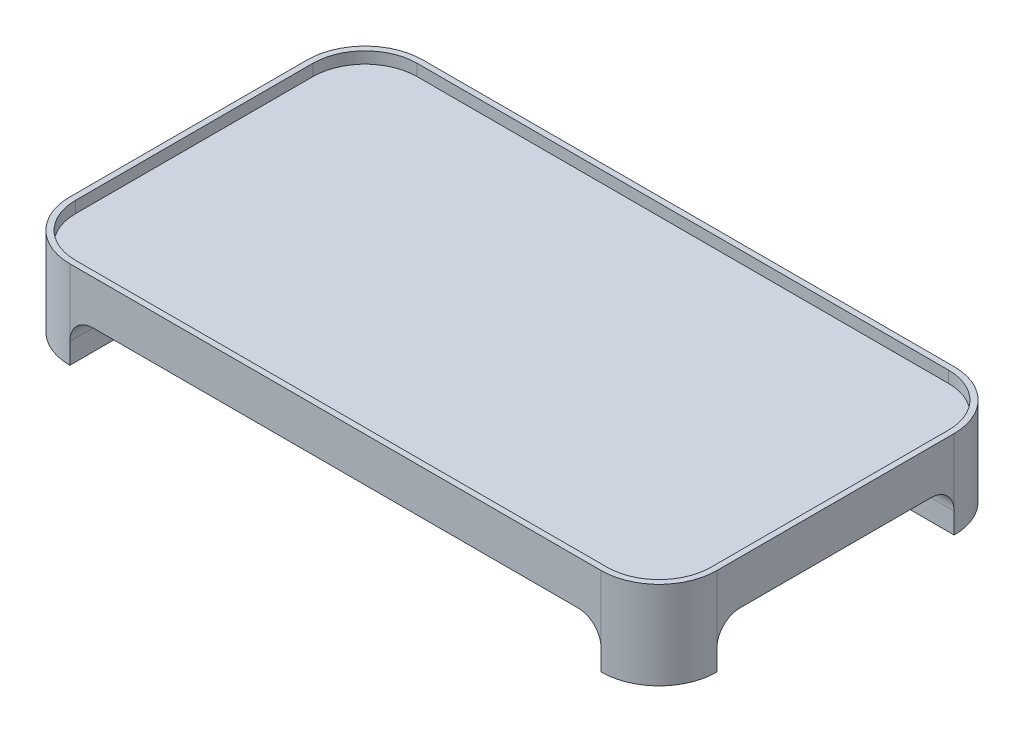
ISO-10303-21;
HEADER;
FILE_DESCRIPTION(('STEP AP214'),'2;1');
FILE_NAME('part.step','',(''),(''),'','','');
FILE_SCHEMA(('AUTOMOTIVE_DESIGN { 1 0 10303 214 1 1 1 1 }'));
ENDSEC;
DATA;
#1=APPLICATION_CONTEXT('core data for automotive mechanical design processes');
#2=APPLICATION_PROTOCOL_DEFINITION('international standard','automotive_design',2000,#1);
#3=PRODUCT_CONTEXT('',#1,'mechanical');
#4=PRODUCT('Part','Part','',(#3));
#5=PRODUCT_RELATED_PRODUCT_CATEGORY('part','',(#4));
#6=PRODUCT_DEFINITION_FORMATION('','',#4);
#7=PRODUCT_DEFINITION_CONTEXT('part definition',#1,'design');
#8=PRODUCT_DEFINITION('design','',#6,#7);
#9=PRODUCT_DEFINITION_SHAPE('','',#8);
#10=(LENGTH_UNIT() NAMED_UNIT(*) SI_UNIT(.MILLI.,.METRE.));
#11=(NAMED_UNIT(*) PLANE_ANGLE_UNIT() SI_UNIT($,.RADIAN.));
#12=(NAMED_UNIT(*) SI_UNIT($,.STERADIAN.) SOLID_ANGLE_UNIT());
#13=UNCERTAINTY_MEASURE_WITH_UNIT(LENGTH_MEASURE(1.E-05),#10,'distance_accuracy_value','');
#14=(GEOMETRIC_REPRESENTATION_CONTEXT(3) GLOBAL_UNCERTAINTY_ASSIGNED_CONTEXT((#13)) GLOBAL_UNIT_ASSIGNED_CONTEXT((#10,
#11,#12)) REPRESENTATION_CONTEXT('',''));
#15=CARTESIAN_POINT('',(0.,0.,0.));
#16=DIRECTION('',(0.,0.,1.));
#17=DIRECTION('',(1.,0.,0.));
#18=AXIS2_PLACEMENT_3D('',#15,#16,#17);
#19=CARTESIAN_POINT('',(-229.5,0.,-102.5));
#20=DIRECTION('',(0.,1.,0.));
#21=DIRECTION('',(0.,0.,1.));
#22=AXIS2_PLACEMENT_3D('',#19,#20,#21);
#23=PLANE('',#22);
#24=DIRECTION('',(0.,0.,1.));
#25=VECTOR('',#24,1.);
#26=CARTESIAN_POINT('',(-229.5,0.,-152.5));
#27=LINE('',#26,#25);
#28=CARTESIAN_POINT('',(-229.5,0.,-152.5));
#29=VERTEX_POINT('',#28);
#30=CARTESIAN_POINT('',(-229.5,0.,-102.5));
#31=VERTEX_POINT('',#30);
#32=EDGE_CURVE('E347',#29,#31,#27,.T.);
#33=ORIENTED_EDGE('',*,*,#32,.T.);
#34=DIRECTION('',(-1.,0.,0.));
#35=VECTOR('',#34,1.);
#36=CARTESIAN_POINT('',(279.5,0.,-102.5));
#37=LINE('',#36,#35);
#38=CARTESIAN_POINT('',(-279.5,0.,-102.5));
#39=VERTEX_POINT('',#38);
#40=EDGE_CURVE('E454',#31,#39,#37,.T.);
#41=ORIENTED_EDGE('',*,*,#40,.T.);
#42=CARTESIAN_POINT('',(-229.5,0.,-102.5));
#43=DIRECTION('',(0.,1.,0.));
#44=DIRECTION('',(0.,0.,1.));
#45=AXIS2_PLACEMENT_3D('',#42,#43,#44);
#46=CIRCLE('',#45,50.);
#47=EDGE_CURVE('E261',#29,#39,#46,.T.);
#48=ORIENTED_EDGE('',*,*,#47,.F.);
#49=EDGE_LOOP('',(#33,#41,#48));
#50=FACE_BOUND('',#49,.T.);
#51=ADVANCED_FACE('F33',(#50),#23,.F.);
#52=CARTESIAN_POINT('',(229.5,0.,-102.5));
#53=DIRECTION('',(0.,1.,0.));
#54=DIRECTION('',(0.,0.,1.));
#55=AXIS2_PLACEMENT_3D('',#52,#53,#54);
#56=CIRCLE('',#55,50.);
#57=CARTESIAN_POINT('',(279.5,0.,-102.5));
#58=VERTEX_POINT('',#57);
#59=CARTESIAN_POINT('',(229.5,0.,-152.5));
#60=VERTEX_POINT('',#59);
#61=EDGE_CURVE('E254',#58,#60,#56,.T.);
#62=ORIENTED_EDGE('',*,*,#61,.F.);
#63=CARTESIAN_POINT('',(229.5,0.,-102.5));
#64=VERTEX_POINT('',#63);
#65=EDGE_CURVE('E309',#58,#64,#37,.T.);
#66=ORIENTED_EDGE('',*,*,#65,.T.);
#67=DIRECTION('',(0.,0.,1.));
#68=VECTOR('',#67,1.);
#69=CARTESIAN_POINT('',(229.5,0.,-152.5));
#70=LINE('',#69,#68);
#71=EDGE_CURVE('E366',#60,#64,#70,.T.);
#72=ORIENTED_EDGE('',*,*,#71,.F.);
#73=EDGE_LOOP('',(#62,#66,#72));
#74=FACE_BOUND('',#73,.T.);
#75=ADVANCED_FACE('F537',(#74),#23,.F.);
#76=CARTESIAN_POINT('',(-229.5,0.,-152.5));
#77=DIRECTION('',(-1.,0.,0.));
#78=DIRECTION('',(0.,0.,1.));
#79=AXIS2_PLACEMENT_3D('',#76,#77,#78);
#80=PLANE('',#79);
#81=DIRECTION('',(0.,0.,1.));
#82=VECTOR('',#81,1.);
#83=CARTESIAN_POINT('',(-229.5,17.9999999999999,-152.5));
#84=LINE('',#83,#82);
#85=CARTESIAN_POINT('',(-229.5,17.9999999999999,-152.5));
#86=VERTEX_POINT('',#85);
#87=CARTESIAN_POINT('',(-229.5,17.9999999999999,-102.5));
#88=VERTEX_POINT('',#87);
#89=EDGE_CURVE('E352',#86,#88,#84,.T.);
#90=ORIENTED_EDGE('',*,*,#89,.T.);
#91=DIRECTION('',(0.,-1.,0.));
#92=VECTOR('',#91,1.);
#93=CARTESIAN_POINT('',(-229.5,0.,-102.5));
#94=LINE('',#93,#92);
#95=EDGE_CURVE('E317',#88,#31,#94,.T.);
#96=ORIENTED_EDGE('',*,*,#95,.T.);
#97=ORIENTED_EDGE('',*,*,#32,.F.);
#98=DIRECTION('',(0.,-1.,0.));
#99=VECTOR('',#98,1.);
#100=CARTESIAN_POINT('',(-229.5,0.,-152.5));
#101=LINE('',#100,#99);
#102=EDGE_CURVE('E333',#86,#29,#101,.T.);
#103=ORIENTED_EDGE('',*,*,#102,.F.);
#104=EDGE_LOOP('',(#90,#96,#97,#103));
#105=FACE_BOUND('',#104,.T.);
#106=ADVANCED_FACE('F550',(#105),#80,.F.);
#107=CARTESIAN_POINT('',(-209.5,18.,-152.5));
#108=DIRECTION('',(0.,0.,1.));
#109=DIRECTION('',(1.,0.,0.));
#110=AXIS2_PLACEMENT_3D('',#107,#108,#109);
#111=CYLINDRICAL_SURFACE('',#110,20.);
#112=DIRECTION('',(0.,0.,1.));
#113=VECTOR('',#112,1.);
#114=CARTESIAN_POINT('',(-209.499999999999,38.,-152.5));
#115=LINE('',#114,#113);
#116=CARTESIAN_POINT('',(-209.499999999999,38.,-152.5));
#117=VERTEX_POINT('',#116);
#118=CARTESIAN_POINT('',(-209.499999999999,38.,-82.4999999999995));
#119=VERTEX_POINT('',#118);
#120=EDGE_CURVE('E356',#117,#119,#115,.T.);
#121=ORIENTED_EDGE('',*,*,#120,.T.);
#122=CARTESIAN_POINT('',(-209.5,18.,-82.4999999999996));
#123=DIRECTION('',(-0.707106781186547,0.,0.707106781186547));
#124=DIRECTION('',(0.707106781186547,0.,0.707106781186547));
#125=AXIS2_PLACEMENT_3D('',#122,#123,#124);
#126=ELLIPSE('',#125,28.2842712474619,20.);
#127=EDGE_CURVE('E314',#119,#88,#126,.T.);
#128=ORIENTED_EDGE('',*,*,#127,.T.);
#129=ORIENTED_EDGE('',*,*,#89,.F.);
#130=CARTESIAN_POINT('',(-209.5,18.,-152.5));
#131=DIRECTION('',(0.,0.,1.));
#132=DIRECTION('',(-1.,0.,0.));
#133=AXIS2_PLACEMENT_3D('',#130,#131,#132);
#134=CIRCLE('',#133,20.);
#135=EDGE_CURVE('E330',#117,#86,#134,.T.);
#136=ORIENTED_EDGE('',*,*,#135,.F.);
#137=EDGE_LOOP('',(#121,#128,#129,#136));
#138=FACE_BOUND('',#137,.T.);
#139=ADVANCED_FACE('F566',(#138),#111,.F.);
#140=CARTESIAN_POINT('',(209.5,18.,-152.5));
#141=DIRECTION('',(0.,0.,1.));
#142=DIRECTION('',(1.,0.,0.));
#143=AXIS2_PLACEMENT_3D('',#140,#141,#142);
#144=CYLINDRICAL_SURFACE('',#143,20.);
#145=DIRECTION('',(0.,0.,1.));
#146=VECTOR('',#145,1.);
#147=CARTESIAN_POINT('',(229.5,17.9999999999999,-152.5));
#148=LINE('',#147,#146);
#149=CARTESIAN_POINT('',(229.5,17.9999999999999,-152.5));
#150=VERTEX_POINT('',#149);
#151=CARTESIAN_POINT('',(229.5,17.9999999999999,-102.5));
#152=VERTEX_POINT('',#151);
#153=EDGE_CURVE('E363',#150,#152,#148,.T.);
#154=ORIENTED_EDGE('',*,*,#153,.T.);
#155=CARTESIAN_POINT('',(209.5,18.,-82.4999999999996));
#156=DIRECTION('',(0.707106781186547,0.,0.707106781186547));
#157=DIRECTION('',(-0.707106781186547,0.,0.707106781186547));
#158=AXIS2_PLACEMENT_3D('',#155,#156,#157);
#159=ELLIPSE('',#158,28.2842712474619,20.);
#160=CARTESIAN_POINT('',(209.5,38.,-82.4999999999995));
#161=VERTEX_POINT('',#160);
#162=EDGE_CURVE('E306',#152,#161,#159,.T.);
#163=ORIENTED_EDGE('',*,*,#162,.T.);
#164=DIRECTION('',(0.,0.,1.));
#165=VECTOR('',#164,1.);
#166=CARTESIAN_POINT('',(209.5,38.,-152.5));
#167=LINE('',#166,#165);
#168=CARTESIAN_POINT('',(209.5,38.,-152.5));
#169=VERTEX_POINT('',#168);
#170=EDGE_CURVE('E360',#169,#161,#167,.T.);
#171=ORIENTED_EDGE('',*,*,#170,.F.);
#172=CARTESIAN_POINT('',(209.5,18.,-152.5));
#173=DIRECTION('',(0.,0.,1.));
#174=DIRECTION('',(1.,0.,0.));
#175=AXIS2_PLACEMENT_3D('',#172,#173,#174);
#176=CIRCLE('',#175,20.);
#177=EDGE_CURVE('E323',#150,#169,#176,.T.);
#178=ORIENTED_EDGE('',*,*,#177,.F.);
#179=EDGE_LOOP('',(#154,#163,#171,#178));
#180=FACE_BOUND('',#179,.T.);
#181=ADVANCED_FACE('F542',(#180),#144,.F.);
#182=CARTESIAN_POINT('',(229.5,17.9999999999999,-152.5));
#183=DIRECTION('',(1.,0.,0.));
#184=DIRECTION('',(0.,0.,-1.));
#185=AXIS2_PLACEMENT_3D('',#182,#183,#184);
#186=PLANE('',#185);
#187=ORIENTED_EDGE('',*,*,#71,.T.);
#188=DIRECTION('',(0.,1.,0.));
#189=VECTOR('',#188,1.);
#190=CARTESIAN_POINT('',(229.5,17.9999999999999,-102.5));
#191=LINE('',#190,#189);
#192=EDGE_CURVE('E11',#64,#152,#191,.T.);
#193=ORIENTED_EDGE('',*,*,#192,.T.);
#194=ORIENTED_EDGE('',*,*,#153,.F.);
#195=DIRECTION('',(0.,1.,0.));
#196=VECTOR('',#195,1.);
#197=CARTESIAN_POINT('',(229.5,17.9999999999999,-152.5));
#198=LINE('',#197,#196);
#199=EDGE_CURVE('E320',#60,#150,#198,.T.);
#200=ORIENTED_EDGE('',*,*,#199,.F.);
#201=EDGE_LOOP('',(#187,#193,#194,#200));
#202=FACE_BOUND('',#201,.T.);
#203=ADVANCED_FACE('F535',(#202),#186,.F.);
#204=CARTESIAN_POINT('',(-229.5,0.,102.5));
#205=DIRECTION('',(0.,1.,0.));
#206=DIRECTION('',(0.,0.,-1.));
#207=AXIS2_PLACEMENT_3D('',#204,#205,#206);
#208=CIRCLE('',#207,50.);
#209=CARTESIAN_POINT('',(-279.5,0.,102.5));
#210=VERTEX_POINT('',#209);
#211=CARTESIAN_POINT('',(-229.5,0.,152.5));
#212=VERTEX_POINT('',#211);
#213=EDGE_CURVE('E255',#210,#212,#208,.T.);
#214=ORIENTED_EDGE('',*,*,#213,.F.);
#215=DIRECTION('',(-1.,0.,0.));
#216=VECTOR('',#215,1.);
#217=CARTESIAN_POINT('',(279.5,0.,102.5));
#218=LINE('',#217,#216);
#219=CARTESIAN_POINT('',(-229.5,0.,102.5));
#220=VERTEX_POINT('',#219);
#221=EDGE_CURVE('E247',#220,#210,#218,.T.);
#222=ORIENTED_EDGE('',*,*,#221,.F.);
#223=EDGE_CURVE('E351',#220,#212,#27,.T.);
#224=ORIENTED_EDGE('',*,*,#223,.T.);
#225=EDGE_LOOP('',(#214,#222,#224));
#226=FACE_BOUND('',#225,.T.);
#227=ADVANCED_FACE('F533',(#226),#23,.F.);
#228=CARTESIAN_POINT('',(-229.5,76.,-102.5));
#229=DIRECTION('',(0.,-1.,0.));
#230=DIRECTION('',(0.,0.,-1.));
#231=AXIS2_PLACEMENT_3D('',#228,#229,#230);
#232=CYLINDRICAL_SURFACE('',#231,50.);
#233=ORIENTED_EDGE('',*,*,#47,.T.);
#234=DIRECTION('',(0.,-1.,0.));
#235=VECTOR('',#234,1.);
#236=CARTESIAN_POINT('',(-279.5,0.,-102.5));
#237=LINE('',#236,#235);
#238=CARTESIAN_POINT('',(-279.5,17.9999999999999,-102.5));
#239=VERTEX_POINT('',#238);
#240=EDGE_CURVE('E238',#239,#39,#237,.T.);
#241=ORIENTED_EDGE('',*,*,#240,.F.);
#242=DIRECTION('',(0.,-1.,0.));
#243=VECTOR('',#242,1.);
#244=CARTESIAN_POINT('',(-279.5,76.,-102.5));
#245=LINE('',#244,#243);
#246=CARTESIAN_POINT('',(-279.5,76.,-102.5));
#247=VERTEX_POINT('',#246);
#248=EDGE_CURVE('E285',#247,#239,#245,.T.);
#249=ORIENTED_EDGE('',*,*,#248,.F.);
#250=CARTESIAN_POINT('',(-229.5,76.,-102.5));
#251=DIRECTION('',(0.,1.,0.));
#252=DIRECTION('',(0.,0.,1.));
#253=AXIS2_PLACEMENT_3D('',#250,#251,#252);
#254=CIRCLE('',#253,50.);
#255=CARTESIAN_POINT('',(-229.5,76.,-152.5));
#256=VERTEX_POINT('',#255);
#257=EDGE_CURVE('E258',#256,#247,#254,.T.);
#258=ORIENTED_EDGE('',*,*,#257,.F.);
#259=DIRECTION('',(0.,-1.,0.));
#260=VECTOR('',#259,1.);
#261=CARTESIAN_POINT('',(-229.5,76.,-152.5));
#262=LINE('',#261,#260);
#263=EDGE_CURVE('E265',#256,#86,#262,.T.);
#264=ORIENTED_EDGE('',*,*,#263,.T.);
#265=ORIENTED_EDGE('',*,*,#102,.T.);
#266=EDGE_LOOP('',(#233,#241,#249,#258,#264,#265));
#267=FACE_BOUND('',#266,.T.);
#268=ADVANCED_FACE('F35',(#267),#232,.T.);
#269=CARTESIAN_POINT('',(-279.5,76.,-102.5));
#270=DIRECTION('',(1.,0.,0.));
#271=DIRECTION('',(0.,0.,-1.));
#272=AXIS2_PLACEMENT_3D('',#269,#270,#271);
#273=PLANE('',#272);
#274=ORIENTED_EDGE('',*,*,#248,.T.);
#275=CARTESIAN_POINT('',(-279.5,18.,-82.4999999999996));
#276=DIRECTION('',(-1.,0.,0.));
#277=DIRECTION('',(0.,0.,-1.));
#278=AXIS2_PLACEMENT_3D('',#275,#276,#277);
#279=CIRCLE('',#278,20.);
#280=CARTESIAN_POINT('',(-279.5,38.,-82.4999999999995));
#281=VERTEX_POINT('',#280);
#282=EDGE_CURVE('E489',#281,#239,#279,.T.);
#283=ORIENTED_EDGE('',*,*,#282,.F.);
#284=DIRECTION('',(0.,0.,-1.));
#285=VECTOR('',#284,1.);
#286=CARTESIAN_POINT('',(-279.5,38.,-82.4999999999995));
#287=LINE('',#286,#285);
#288=CARTESIAN_POINT('',(-279.5,38.,82.4999999999995));
#289=VERTEX_POINT('',#288);
#290=EDGE_CURVE('E476',#289,#281,#287,.T.);
#291=ORIENTED_EDGE('',*,*,#290,.F.);
#292=CARTESIAN_POINT('',(-279.5,18.,82.4999999999997));
#293=DIRECTION('',(-1.,0.,0.));
#294=DIRECTION('',(0.,0.,1.));
#295=AXIS2_PLACEMENT_3D('',#292,#293,#294);
#296=CIRCLE('',#295,20.);
#297=CARTESIAN_POINT('',(-279.5,17.9999999999999,102.5));
#298=VERTEX_POINT('',#297);
#299=EDGE_CURVE('E479',#298,#289,#296,.T.);
#300=ORIENTED_EDGE('',*,*,#299,.F.);
#301=DIRECTION('',(0.,-1.,0.));
#302=VECTOR('',#301,1.);
#303=CARTESIAN_POINT('',(-279.5,76.,102.5));
#304=LINE('',#303,#302);
#305=CARTESIAN_POINT('',(-279.5,76.,102.5));
#306=VERTEX_POINT('',#305);
#307=EDGE_CURVE('E282',#306,#298,#304,.T.);
#308=ORIENTED_EDGE('',*,*,#307,.F.);
#309=DIRECTION('',(0.,0.,1.));
#310=VECTOR('',#309,1.);
#311=CARTESIAN_POINT('',(-279.5,76.,-102.5));
#312=LINE('',#311,#310);
#313=EDGE_CURVE('E434',#247,#306,#312,.T.);
#314=ORIENTED_EDGE('',*,*,#313,.F.);
#315=EDGE_LOOP('',(#274,#283,#291,#300,#308,#314));
#316=FACE_BOUND('',#315,.T.);
#317=ADVANCED_FACE('F487',(#316),#273,.F.);
#318=CARTESIAN_POINT('',(-229.5,76.,102.5));
#319=DIRECTION('',(0.,-1.,0.));
#320=DIRECTION('',(0.,0.,-1.));
#321=AXIS2_PLACEMENT_3D('',#318,#319,#320);
#322=CYLINDRICAL_SURFACE('',#321,50.);
#323=ORIENTED_EDGE('',*,*,#213,.T.);
#324=DIRECTION('',(0.,-1.,0.));
#325=VECTOR('',#324,1.);
#326=CARTESIAN_POINT('',(-229.5,0.,152.5));
#327=LINE('',#326,#325);
#328=CARTESIAN_POINT('',(-229.5,17.9999999999999,152.5));
#329=VERTEX_POINT('',#328);
#330=EDGE_CURVE('E324',#329,#212,#327,.T.);
#331=ORIENTED_EDGE('',*,*,#330,.F.);
#332=DIRECTION('',(0.,-1.,0.));
#333=VECTOR('',#332,1.);
#334=CARTESIAN_POINT('',(-229.5,76.,152.5));
#335=LINE('',#334,#333);
#336=CARTESIAN_POINT('',(-229.5,76.,152.5));
#337=VERTEX_POINT('',#336);
#338=EDGE_CURVE('E279',#337,#329,#335,.T.);
#339=ORIENTED_EDGE('',*,*,#338,.F.);
#340=CARTESIAN_POINT('',(-229.5,76.,102.5));
#341=DIRECTION('',(0.,1.,0.));
#342=DIRECTION('',(0.,0.,-1.));
#343=AXIS2_PLACEMENT_3D('',#340,#341,#342);
#344=CIRCLE('',#343,50.);
#345=EDGE_CURVE('E436',#306,#337,#344,.T.);
#346=ORIENTED_EDGE('',*,*,#345,.F.);
#347=ORIENTED_EDGE('',*,*,#307,.T.);
#348=DIRECTION('',(0.,1.,0.));
#349=VECTOR('',#348,1.);
#350=CARTESIAN_POINT('',(-279.5,17.9999999999999,102.5));
#351=LINE('',#350,#349);
#352=EDGE_CURVE('E485',#210,#298,#351,.T.);
#353=ORIENTED_EDGE('',*,*,#352,.F.);
#354=EDGE_LOOP('',(#323,#331,#339,#346,#347,#353));
#355=FACE_BOUND('',#354,.T.);
#356=ADVANCED_FACE('F523',(#355),#322,.T.);
#357=CARTESIAN_POINT('',(-229.5,76.,152.5));
#358=DIRECTION('',(0.,0.,-1.));
#359=DIRECTION('',(-1.,0.,0.));
#360=AXIS2_PLACEMENT_3D('',#357,#358,#359);
#361=PLANE('',#360);
#362=ORIENTED_EDGE('',*,*,#338,.T.);
#363=CARTESIAN_POINT('',(-209.5,18.,152.5));
#364=DIRECTION('',(0.,0.,1.));
#365=DIRECTION('',(-1.,0.,0.));
#366=AXIS2_PLACEMENT_3D('',#363,#364,#365);
#367=CIRCLE('',#366,20.);
#368=CARTESIAN_POINT('',(-209.499999999999,38.,152.5));
#369=VERTEX_POINT('',#368);
#370=EDGE_CURVE('E342',#369,#329,#367,.T.);
#371=ORIENTED_EDGE('',*,*,#370,.F.);
#372=DIRECTION('',(-1.,0.,0.));
#373=VECTOR('',#372,1.);
#374=CARTESIAN_POINT('',(-209.499999999999,38.,152.5));
#375=LINE('',#374,#373);
#376=CARTESIAN_POINT('',(209.5,38.,152.5));
#377=VERTEX_POINT('',#376);
#378=EDGE_CURVE('E339',#377,#369,#375,.T.);
#379=ORIENTED_EDGE('',*,*,#378,.F.);
#380=CARTESIAN_POINT('',(209.5,18.,152.5));
#381=DIRECTION('',(0.,0.,1.));
#382=DIRECTION('',(1.,0.,0.));
#383=AXIS2_PLACEMENT_3D('',#380,#381,#382);
#384=CIRCLE('',#383,20.);
#385=CARTESIAN_POINT('',(229.5,17.9999999999999,152.5));
#386=VERTEX_POINT('',#385);
#387=EDGE_CURVE('E337',#386,#377,#384,.T.);
#388=ORIENTED_EDGE('',*,*,#387,.F.);
#389=DIRECTION('',(0.,-1.,0.));
#390=VECTOR('',#389,1.);
#391=CARTESIAN_POINT('',(229.5,76.,152.5));
#392=LINE('',#391,#390);
#393=CARTESIAN_POINT('',(229.5,76.,152.5));
#394=VERTEX_POINT('',#393);
#395=EDGE_CURVE('E277',#394,#386,#392,.T.);
#396=ORIENTED_EDGE('',*,*,#395,.F.);
#397=DIRECTION('',(1.,0.,0.));
#398=VECTOR('',#397,1.);
#399=CARTESIAN_POINT('',(-229.5,76.,152.5));
#400=LINE('',#399,#398);
#401=EDGE_CURVE('E438',#337,#394,#400,.T.);
#402=ORIENTED_EDGE('',*,*,#401,.F.);
#403=EDGE_LOOP('',(#362,#371,#379,#388,#396,#402));
#404=FACE_BOUND('',#403,.T.);
#405=ADVANCED_FACE('F515',(#404),#361,.F.);
#406=CARTESIAN_POINT('',(229.5,76.,102.5));
#407=DIRECTION('',(0.,-1.,0.));
#408=DIRECTION('',(0.,0.,-1.));
#409=AXIS2_PLACEMENT_3D('',#406,#407,#408);
#410=CYLINDRICAL_SURFACE('',#409,50.);
#411=CARTESIAN_POINT('',(229.5,0.,102.5));
#412=DIRECTION('',(0.,1.,0.));
#413=DIRECTION('',(0.,0.,-1.));
#414=AXIS2_PLACEMENT_3D('',#411,#412,#413);
#415=CIRCLE('',#414,50.);
#416=CARTESIAN_POINT('',(229.5,0.,152.5));
#417=VERTEX_POINT('',#416);
#418=CARTESIAN_POINT('',(279.5,0.,102.5));
#419=VERTEX_POINT('',#418);
#420=EDGE_CURVE('E244',#417,#419,#415,.T.);
#421=ORIENTED_EDGE('',*,*,#420,.T.);
#422=DIRECTION('',(0.,1.,0.));
#423=VECTOR('',#422,1.);
#424=CARTESIAN_POINT('',(279.5,17.9999999999999,102.5));
#425=LINE('',#424,#423);
#426=CARTESIAN_POINT('',(279.5,17.9999999999999,102.5));
#427=VERTEX_POINT('',#426);
#428=EDGE_CURVE('E228',#419,#427,#425,.T.);
#429=ORIENTED_EDGE('',*,*,#428,.T.);
#430=DIRECTION('',(0.,-1.,0.));
#431=VECTOR('',#430,1.);
#432=CARTESIAN_POINT('',(279.5,76.,102.5));
#433=LINE('',#432,#431);
#434=CARTESIAN_POINT('',(279.5,76.,102.5));
#435=VERTEX_POINT('',#434);
#436=EDGE_CURVE('E275',#435,#427,#433,.T.);
#437=ORIENTED_EDGE('',*,*,#436,.F.);
#438=CARTESIAN_POINT('',(229.5,76.,102.5));
#439=DIRECTION('',(0.,1.,0.));
#440=DIRECTION('',(0.,0.,-1.));
#441=AXIS2_PLACEMENT_3D('',#438,#439,#440);
#442=CIRCLE('',#441,50.);
#443=EDGE_CURVE('E440',#394,#435,#442,.T.);
#444=ORIENTED_EDGE('',*,*,#443,.F.);
#445=ORIENTED_EDGE('',*,*,#395,.T.);
#446=DIRECTION('',(0.,1.,0.));
#447=VECTOR('',#446,1.);
#448=CARTESIAN_POINT('',(229.5,17.9999999999999,152.5));
#449=LINE('',#448,#447);
#450=EDGE_CURVE('E253',#417,#386,#449,.T.);
#451=ORIENTED_EDGE('',*,*,#450,.F.);
#452=EDGE_LOOP('',(#421,#429,#437,#444,#445,#451));
#453=FACE_BOUND('',#452,.T.);
#454=ADVANCED_FACE('F250',(#453),#410,.T.);
#455=CARTESIAN_POINT('',(279.5,76.,-102.5));
#456=DIRECTION('',(-1.,0.,0.));
#457=DIRECTION('',(0.,0.,1.));
#458=AXIS2_PLACEMENT_3D('',#455,#456,#457);
#459=PLANE('',#458);
#460=DIRECTION('',(0.,0.,-1.));
#461=VECTOR('',#460,1.);
#462=CARTESIAN_POINT('',(279.5,38.,-82.4999999999995));
#463=LINE('',#462,#461);
#464=CARTESIAN_POINT('',(279.5,38.,82.4999999999995));
#465=VERTEX_POINT('',#464);
#466=CARTESIAN_POINT('',(279.5,38.,-82.4999999999995));
#467=VERTEX_POINT('',#466);
#468=EDGE_CURVE('E499',#465,#467,#463,.T.);
#469=ORIENTED_EDGE('',*,*,#468,.T.);
#470=CARTESIAN_POINT('',(279.5,18.,-82.4999999999996));
#471=DIRECTION('',(-1.,0.,0.));
#472=DIRECTION('',(0.,0.,-1.));
#473=AXIS2_PLACEMENT_3D('',#470,#471,#472);
#474=CIRCLE('',#473,20.);
#475=CARTESIAN_POINT('',(279.5,17.9999999999999,-102.5));
#476=VERTEX_POINT('',#475);
#477=EDGE_CURVE('E496',#467,#476,#474,.T.);
#478=ORIENTED_EDGE('',*,*,#477,.T.);
#479=DIRECTION('',(0.,-1.,0.));
#480=VECTOR('',#479,1.);
#481=CARTESIAN_POINT('',(279.5,76.,-102.5));
#482=LINE('',#481,#480);
#483=CARTESIAN_POINT('',(279.5,76.,-102.5));
#484=VERTEX_POINT('',#483);
#485=EDGE_CURVE('E272',#484,#476,#482,.T.);
#486=ORIENTED_EDGE('',*,*,#485,.F.);
#487=DIRECTION('',(0.,0.,-1.));
#488=VECTOR('',#487,1.);
#489=CARTESIAN_POINT('',(279.5,76.,-102.5));
#490=LINE('',#489,#488);
#491=EDGE_CURVE('E442',#435,#484,#490,.T.);
#492=ORIENTED_EDGE('',*,*,#491,.F.);
#493=ORIENTED_EDGE('',*,*,#436,.T.);
#494=CARTESIAN_POINT('',(279.5,18.,82.4999999999997));
#495=DIRECTION('',(-1.,0.,0.));
#496=DIRECTION('',(0.,0.,1.));
#497=AXIS2_PLACEMENT_3D('',#494,#495,#496);
#498=CIRCLE('',#497,20.);
#499=EDGE_CURVE('E237',#427,#465,#498,.T.);
#500=ORIENTED_EDGE('',*,*,#499,.T.);
#501=EDGE_LOOP('',(#469,#478,#486,#492,#493,#500));
#502=FACE_BOUND('',#501,.T.);
#503=ADVANCED_FACE('F503',(#502),#459,.F.);
#504=CARTESIAN_POINT('',(229.5,76.,-102.5));
#505=DIRECTION('',(0.,-1.,0.));
#506=DIRECTION('',(0.,0.,-1.));
#507=AXIS2_PLACEMENT_3D('',#504,#505,#506);
#508=CYLINDRICAL_SURFACE('',#507,50.);
#509=ORIENTED_EDGE('',*,*,#61,.T.);
#510=ORIENTED_EDGE('',*,*,#199,.T.);
#511=DIRECTION('',(0.,-1.,0.));
#512=VECTOR('',#511,1.);
#513=CARTESIAN_POINT('',(229.5,76.,-152.5));
#514=LINE('',#513,#512);
#515=CARTESIAN_POINT('',(229.5,76.,-152.5));
#516=VERTEX_POINT('',#515);
#517=EDGE_CURVE('E268',#516,#150,#514,.T.);
#518=ORIENTED_EDGE('',*,*,#517,.F.);
#519=CARTESIAN_POINT('',(229.5,76.,-102.5));
#520=DIRECTION('',(0.,1.,0.));
#521=DIRECTION('',(0.,0.,1.));
#522=AXIS2_PLACEMENT_3D('',#519,#520,#521);
#523=CIRCLE('',#522,50.);
#524=EDGE_CURVE('E444',#484,#516,#523,.T.);
#525=ORIENTED_EDGE('',*,*,#524,.F.);
#526=ORIENTED_EDGE('',*,*,#485,.T.);
#527=DIRECTION('',(0.,-1.,0.));
#528=VECTOR('',#527,1.);
#529=CARTESIAN_POINT('',(279.5,0.,-102.5));
#530=LINE('',#529,#528);
#531=EDGE_CURVE('E493',#476,#58,#530,.T.);
#532=ORIENTED_EDGE('',*,*,#531,.T.);
#533=EDGE_LOOP('',(#509,#510,#518,#525,#526,#532));
#534=FACE_BOUND('',#533,.T.);
#535=ADVANCED_FACE('F633',(#534),#508,.T.);
#536=CARTESIAN_POINT('',(-229.5,76.,-152.5));
#537=DIRECTION('',(0.,0.,1.));
#538=DIRECTION('',(1.,0.,0.));
#539=AXIS2_PLACEMENT_3D('',#536,#537,#538);
#540=PLANE('',#539);
#541=DIRECTION('',(-1.,0.,0.));
#542=VECTOR('',#541,1.);
#543=CARTESIAN_POINT('',(-209.499999999999,38.,-152.5));
#544=LINE('',#543,#542);
#545=EDGE_CURVE('E327',#169,#117,#544,.T.);
#546=ORIENTED_EDGE('',*,*,#545,.T.);
#547=ORIENTED_EDGE('',*,*,#135,.T.);
#548=ORIENTED_EDGE('',*,*,#263,.F.);
#549=DIRECTION('',(-1.,0.,0.));
#550=VECTOR('',#549,1.);
#551=CARTESIAN_POINT('',(-229.5,76.,-152.5));
#552=LINE('',#551,#550);
#553=EDGE_CURVE('E269',#516,#256,#552,.T.);
#554=ORIENTED_EDGE('',*,*,#553,.F.);
#555=ORIENTED_EDGE('',*,*,#517,.T.);
#556=ORIENTED_EDGE('',*,*,#177,.T.);
#557=EDGE_LOOP('',(#546,#547,#548,#554,#555,#556));
#558=FACE_BOUND('',#557,.T.);
#559=ADVANCED_FACE('F642',(#558),#540,.F.);
#560=CARTESIAN_POINT('',(-229.5,76.,-102.5));
#561=DIRECTION('',(0.,1.,0.));
#562=DIRECTION('',(0.,0.,1.));
#563=AXIS2_PLACEMENT_3D('',#560,#561,#562);
#564=PLANE('',#563);
#565=CARTESIAN_POINT('',(-229.5,76.,-102.5));
#566=DIRECTION('',(0.,1.,0.));
#567=DIRECTION('',(0.,0.,1.));
#568=AXIS2_PLACEMENT_3D('',#565,#566,#567);
#569=CIRCLE('',#568,45.);
#570=CARTESIAN_POINT('',(-229.5,76.,-147.5));
#571=VERTEX_POINT('',#570);
#572=CARTESIAN_POINT('',(-274.5,76.,-102.5));
#573=VERTEX_POINT('',#572);
#574=EDGE_CURVE('E350',#571,#573,#569,.T.);
#575=ORIENTED_EDGE('',*,*,#574,.F.);
#576=DIRECTION('',(-1.,0.,0.));
#577=VECTOR('',#576,1.);
#578=CARTESIAN_POINT('',(229.5,76.,-147.5));
#579=LINE('',#578,#577);
#580=CARTESIAN_POINT('',(229.5,76.,-147.5));
#581=VERTEX_POINT('',#580);
#582=EDGE_CURVE('E373',#581,#571,#579,.T.);
#583=ORIENTED_EDGE('',*,*,#582,.F.);
#584=CARTESIAN_POINT('',(229.5,76.,-102.5));
#585=DIRECTION('',(0.,1.,0.));
#586=DIRECTION('',(0.,0.,1.));
#587=AXIS2_PLACEMENT_3D('',#584,#585,#586);
#588=CIRCLE('',#587,45.);
#589=CARTESIAN_POINT('',(274.5,76.,-102.5));
#590=VERTEX_POINT('',#589);
#591=EDGE_CURVE('E411',#590,#581,#588,.T.);
#592=ORIENTED_EDGE('',*,*,#591,.F.);
#593=DIRECTION('',(0.,0.,-1.));
#594=VECTOR('',#593,1.);
#595=CARTESIAN_POINT('',(274.5,76.,102.5));
#596=LINE('',#595,#594);
#597=CARTESIAN_POINT('',(274.5,76.,102.5));
#598=VERTEX_POINT('',#597);
#599=EDGE_CURVE('E408',#598,#590,#596,.T.);
#600=ORIENTED_EDGE('',*,*,#599,.F.);
#601=CARTESIAN_POINT('',(229.5,76.,102.5));
#602=DIRECTION('',(0.,1.,0.));
#603=DIRECTION('',(0.,0.,1.));
#604=AXIS2_PLACEMENT_3D('',#601,#602,#603);
#605=CIRCLE('',#604,45.);
#606=CARTESIAN_POINT('',(229.5,76.,147.5));
#607=VERTEX_POINT('',#606);
#608=EDGE_CURVE('E405',#607,#598,#605,.T.);
#609=ORIENTED_EDGE('',*,*,#608,.F.);
#610=DIRECTION('',(1.,0.,0.));
#611=VECTOR('',#610,1.);
#612=CARTESIAN_POINT('',(-229.5,76.,147.5));
#613=LINE('',#612,#611);
#614=CARTESIAN_POINT('',(-229.5,76.,147.5));
#615=VERTEX_POINT('',#614);
#616=EDGE_CURVE('E402',#615,#607,#613,.T.);
#617=ORIENTED_EDGE('',*,*,#616,.F.);
#618=CARTESIAN_POINT('',(-229.5,76.,102.5));
#619=DIRECTION('',(0.,1.,0.));
#620=DIRECTION('',(0.,0.,1.));
#621=AXIS2_PLACEMENT_3D('',#618,#619,#620);
#622=CIRCLE('',#621,45.);
#623=CARTESIAN_POINT('',(-274.5,76.,102.5));
#624=VERTEX_POINT('',#623);
#625=EDGE_CURVE('E399',#624,#615,#622,.T.);
#626=ORIENTED_EDGE('',*,*,#625,.F.);
#627=DIRECTION('',(0.,0.,1.));
#628=VECTOR('',#627,1.);
#629=CARTESIAN_POINT('',(-274.5,76.,-102.5));
#630=LINE('',#629,#628);
#631=EDGE_CURVE('E396',#573,#624,#630,.T.);
#632=ORIENTED_EDGE('',*,*,#631,.F.);
#633=EDGE_LOOP('',(#575,#583,#592,#600,#609,#617,#626,#632));
#634=FACE_BOUND('',#633,.T.);
#635=ORIENTED_EDGE('',*,*,#257,.T.);
#636=ORIENTED_EDGE('',*,*,#313,.T.);
#637=ORIENTED_EDGE('',*,*,#345,.T.);
#638=ORIENTED_EDGE('',*,*,#401,.T.);
#639=ORIENTED_EDGE('',*,*,#443,.T.);
#640=ORIENTED_EDGE('',*,*,#491,.T.);
#641=ORIENTED_EDGE('',*,*,#524,.T.);
#642=ORIENTED_EDGE('',*,*,#553,.T.);
#643=EDGE_LOOP('',(#635,#636,#637,#638,#639,#640,#641,#642));
#644=FACE_BOUND('',#643,.T.);
#645=ADVANCED_FACE('F509',(#634,#644),#564,.T.);
#646=CARTESIAN_POINT('',(229.5,0.,102.5));
#647=VERTEX_POINT('',#646);
#648=EDGE_CURVE('E245',#647,#417,#70,.T.);
#649=ORIENTED_EDGE('',*,*,#648,.F.);
#650=EDGE_CURVE('E56',#419,#647,#218,.T.);
#651=ORIENTED_EDGE('',*,*,#650,.F.);
#652=ORIENTED_EDGE('',*,*,#420,.F.);
#653=EDGE_LOOP('',(#649,#651,#652));
#654=FACE_BOUND('',#653,.T.);
#655=ADVANCED_FACE('F243',(#654),#23,.F.);
#656=CARTESIAN_POINT('',(-229.5,66.,-102.5));
#657=DIRECTION('',(0.,1.,0.));
#658=DIRECTION('',(0.,0.,1.));
#659=AXIS2_PLACEMENT_3D('',#656,#657,#658);
#660=CYLINDRICAL_SURFACE('',#659,45.);
#661=ORIENTED_EDGE('',*,*,#574,.T.);
#662=DIRECTION('',(0.,1.,0.));
#663=VECTOR('',#662,1.);
#664=CARTESIAN_POINT('',(-274.5,66.,-102.5));
#665=LINE('',#664,#663);
#666=CARTESIAN_POINT('',(-274.5,66.,-102.5));
#667=VERTEX_POINT('',#666);
#668=EDGE_CURVE('E394',#667,#573,#665,.T.);
#669=ORIENTED_EDGE('',*,*,#668,.F.);
#670=CARTESIAN_POINT('',(-229.5,66.,-102.5));
#671=DIRECTION('',(0.,1.,0.));
#672=DIRECTION('',(0.,0.,1.));
#673=AXIS2_PLACEMENT_3D('',#670,#671,#672);
#674=CIRCLE('',#673,45.);
#675=CARTESIAN_POINT('',(-229.5,66.,-147.5));
#676=VERTEX_POINT('',#675);
#677=EDGE_CURVE('E369',#676,#667,#674,.T.);
#678=ORIENTED_EDGE('',*,*,#677,.F.);
#679=DIRECTION('',(0.,1.,0.));
#680=VECTOR('',#679,1.);
#681=CARTESIAN_POINT('',(-229.5,66.,-147.5));
#682=LINE('',#681,#680);
#683=EDGE_CURVE('E416',#676,#571,#682,.T.);
#684=ORIENTED_EDGE('',*,*,#683,.T.);
#685=EDGE_LOOP('',(#661,#669,#678,#684));
#686=FACE_BOUND('',#685,.T.);
#687=ADVANCED_FACE('F548',(#686),#660,.F.);
#688=CARTESIAN_POINT('',(229.5,66.,-147.5));
#689=DIRECTION('',(0.,0.,-1.));
#690=DIRECTION('',(-1.,0.,0.));
#691=AXIS2_PLACEMENT_3D('',#688,#689,#690);
#692=PLANE('',#691);
#693=ORIENTED_EDGE('',*,*,#582,.T.);
#694=ORIENTED_EDGE('',*,*,#683,.F.);
#695=DIRECTION('',(-1.,0.,0.));
#696=VECTOR('',#695,1.);
#697=CARTESIAN_POINT('',(229.5,66.,-147.5));
#698=LINE('',#697,#696);
#699=CARTESIAN_POINT('',(229.5,66.,-147.5));
#700=VERTEX_POINT('',#699);
#701=EDGE_CURVE('E391',#700,#676,#698,.T.);
#702=ORIENTED_EDGE('',*,*,#701,.F.);
#703=DIRECTION('',(0.,1.,0.));
#704=VECTOR('',#703,1.);
#705=CARTESIAN_POINT('',(229.5,66.,-147.5));
#706=LINE('',#705,#704);
#707=EDGE_CURVE('E418',#700,#581,#706,.T.);
#708=ORIENTED_EDGE('',*,*,#707,.T.);
#709=EDGE_LOOP('',(#693,#694,#702,#708));
#710=FACE_BOUND('',#709,.T.);
#711=ADVANCED_FACE('F767',(#710),#692,.F.);
#712=CARTESIAN_POINT('',(229.5,66.,-102.5));
#713=DIRECTION('',(0.,1.,0.));
#714=DIRECTION('',(0.,0.,1.));
#715=AXIS2_PLACEMENT_3D('',#712,#713,#714);
#716=CYLINDRICAL_SURFACE('',#715,45.);
#717=ORIENTED_EDGE('',*,*,#591,.T.);
#718=ORIENTED_EDGE('',*,*,#707,.F.);
#719=CARTESIAN_POINT('',(229.5,66.,-102.5));
#720=DIRECTION('',(0.,1.,0.));
#721=DIRECTION('',(0.,0.,1.));
#722=AXIS2_PLACEMENT_3D('',#719,#720,#721);
#723=CIRCLE('',#722,45.);
#724=CARTESIAN_POINT('',(274.5,66.,-102.5));
#725=VERTEX_POINT('',#724);
#726=EDGE_CURVE('E388',#725,#700,#723,.T.);
#727=ORIENTED_EDGE('',*,*,#726,.F.);
#728=DIRECTION('',(0.,1.,0.));
#729=VECTOR('',#728,1.);
#730=CARTESIAN_POINT('',(274.5,66.,-102.5));
#731=LINE('',#730,#729);
#732=EDGE_CURVE('E420',#725,#590,#731,.T.);
#733=ORIENTED_EDGE('',*,*,#732,.T.);
#734=EDGE_LOOP('',(#717,#718,#727,#733));
#735=FACE_BOUND('',#734,.T.);
#736=ADVANCED_FACE('F770',(#735),#716,.F.);
#737=CARTESIAN_POINT('',(274.5,66.,102.5));
#738=DIRECTION('',(1.,0.,0.));
#739=DIRECTION('',(0.,0.,-1.));
#740=AXIS2_PLACEMENT_3D('',#737,#738,#739);
#741=PLANE('',#740);
#742=ORIENTED_EDGE('',*,*,#599,.T.);
#743=ORIENTED_EDGE('',*,*,#732,.F.);
#744=DIRECTION('',(0.,0.,-1.));
#745=VECTOR('',#744,1.);
#746=CARTESIAN_POINT('',(274.5,66.,102.5));
#747=LINE('',#746,#745);
#748=CARTESIAN_POINT('',(274.5,66.,102.5));
#749=VERTEX_POINT('',#748);
#750=EDGE_CURVE('E385',#749,#725,#747,.T.);
#751=ORIENTED_EDGE('',*,*,#750,.F.);
#752=DIRECTION('',(0.,1.,0.));
#753=VECTOR('',#752,1.);
#754=CARTESIAN_POINT('',(274.5,66.,102.5));
#755=LINE('',#754,#753);
#756=EDGE_CURVE('E422',#749,#598,#755,.T.);
#757=ORIENTED_EDGE('',*,*,#756,.T.);
#758=EDGE_LOOP('',(#742,#743,#751,#757));
#759=FACE_BOUND('',#758,.T.);
#760=ADVANCED_FACE('F774',(#759),#741,.F.);
#761=CARTESIAN_POINT('',(229.5,66.,102.5));
#762=DIRECTION('',(0.,1.,0.));
#763=DIRECTION('',(0.,0.,1.));
#764=AXIS2_PLACEMENT_3D('',#761,#762,#763);
#765=CYLINDRICAL_SURFACE('',#764,45.);
#766=ORIENTED_EDGE('',*,*,#608,.T.);
#767=ORIENTED_EDGE('',*,*,#756,.F.);
#768=CARTESIAN_POINT('',(229.5,66.,102.5));
#769=DIRECTION('',(0.,1.,0.));
#770=DIRECTION('',(0.,0.,1.));
#771=AXIS2_PLACEMENT_3D('',#768,#769,#770);
#772=CIRCLE('',#771,45.);
#773=CARTESIAN_POINT('',(229.5,66.,147.5));
#774=VERTEX_POINT('',#773);
#775=EDGE_CURVE('E382',#774,#749,#772,.T.);
#776=ORIENTED_EDGE('',*,*,#775,.F.);
#777=DIRECTION('',(0.,1.,0.));
#778=VECTOR('',#777,1.);
#779=CARTESIAN_POINT('',(229.5,66.,147.5));
#780=LINE('',#779,#778);
#781=EDGE_CURVE('E424',#774,#607,#780,.T.);
#782=ORIENTED_EDGE('',*,*,#781,.T.);
#783=EDGE_LOOP('',(#766,#767,#776,#782));
#784=FACE_BOUND('',#783,.T.);
#785=ADVANCED_FACE('F778',(#784),#765,.F.);
#786=CARTESIAN_POINT('',(-229.5,66.,147.5));
#787=DIRECTION('',(0.,0.,1.));
#788=DIRECTION('',(1.,0.,0.));
#789=AXIS2_PLACEMENT_3D('',#786,#787,#788);
#790=PLANE('',#789);
#791=ORIENTED_EDGE('',*,*,#616,.T.);
#792=ORIENTED_EDGE('',*,*,#781,.F.);
#793=DIRECTION('',(1.,0.,0.));
#794=VECTOR('',#793,1.);
#795=CARTESIAN_POINT('',(-229.5,66.,147.5));
#796=LINE('',#795,#794);
#797=CARTESIAN_POINT('',(-229.5,66.,147.5));
#798=VERTEX_POINT('',#797);
#799=EDGE_CURVE('E379',#798,#774,#796,.T.);
#800=ORIENTED_EDGE('',*,*,#799,.F.);
#801=DIRECTION('',(0.,1.,0.));
#802=VECTOR('',#801,1.);
#803=CARTESIAN_POINT('',(-229.5,66.,147.5));
#804=LINE('',#803,#802);
#805=EDGE_CURVE('E426',#798,#615,#804,.T.);
#806=ORIENTED_EDGE('',*,*,#805,.T.);
#807=EDGE_LOOP('',(#791,#792,#800,#806));
#808=FACE_BOUND('',#807,.T.);
#809=ADVANCED_FACE('F782',(#808),#790,.F.);
#810=CARTESIAN_POINT('',(-229.5,66.,102.5));
#811=DIRECTION('',(0.,1.,0.));
#812=DIRECTION('',(0.,0.,1.));
#813=AXIS2_PLACEMENT_3D('',#810,#811,#812);
#814=CYLINDRICAL_SURFACE('',#813,45.);
#815=ORIENTED_EDGE('',*,*,#625,.T.);
#816=ORIENTED_EDGE('',*,*,#805,.F.);
#817=CARTESIAN_POINT('',(-229.5,66.,102.5));
#818=DIRECTION('',(0.,1.,0.));
#819=DIRECTION('',(0.,0.,1.));
#820=AXIS2_PLACEMENT_3D('',#817,#818,#819);
#821=CIRCLE('',#820,45.);
#822=CARTESIAN_POINT('',(-274.5,66.,102.5));
#823=VERTEX_POINT('',#822);
#824=EDGE_CURVE('E376',#823,#798,#821,.T.);
#825=ORIENTED_EDGE('',*,*,#824,.F.);
#826=DIRECTION('',(0.,1.,0.));
#827=VECTOR('',#826,1.);
#828=CARTESIAN_POINT('',(-274.5,66.,102.5));
#829=LINE('',#828,#827);
#830=EDGE_CURVE('E428',#823,#624,#829,.T.);
#831=ORIENTED_EDGE('',*,*,#830,.T.);
#832=EDGE_LOOP('',(#815,#816,#825,#831));
#833=FACE_BOUND('',#832,.T.);
#834=ADVANCED_FACE('F786',(#833),#814,.F.);
#835=CARTESIAN_POINT('',(-274.5,66.,-102.5));
#836=DIRECTION('',(-1.,0.,0.));
#837=DIRECTION('',(0.,0.,1.));
#838=AXIS2_PLACEMENT_3D('',#835,#836,#837);
#839=PLANE('',#838);
#840=ORIENTED_EDGE('',*,*,#631,.T.);
#841=ORIENTED_EDGE('',*,*,#830,.F.);
#842=DIRECTION('',(0.,0.,1.));
#843=VECTOR('',#842,1.);
#844=CARTESIAN_POINT('',(-274.5,66.,-102.5));
#845=LINE('',#844,#843);
#846=EDGE_CURVE('E372',#667,#823,#845,.T.);
#847=ORIENTED_EDGE('',*,*,#846,.F.);
#848=ORIENTED_EDGE('',*,*,#668,.T.);
#849=EDGE_LOOP('',(#840,#841,#847,#848));
#850=FACE_BOUND('',#849,.T.);
#851=ADVANCED_FACE('F765',(#850),#839,.F.);
#852=CARTESIAN_POINT('',(-229.5,66.,-102.5));
#853=DIRECTION('',(0.,1.,0.));
#854=DIRECTION('',(0.,0.,1.));
#855=AXIS2_PLACEMENT_3D('',#852,#853,#854);
#856=PLANE('',#855);
#857=ORIENTED_EDGE('',*,*,#677,.T.);
#858=ORIENTED_EDGE('',*,*,#846,.T.);
#859=ORIENTED_EDGE('',*,*,#824,.T.);
#860=ORIENTED_EDGE('',*,*,#799,.T.);
#861=ORIENTED_EDGE('',*,*,#775,.T.);
#862=ORIENTED_EDGE('',*,*,#750,.T.);
#863=ORIENTED_EDGE('',*,*,#726,.T.);
#864=ORIENTED_EDGE('',*,*,#701,.T.);
#865=EDGE_LOOP('',(#857,#858,#859,#860,#861,#862,#863,#864));
#866=FACE_BOUND('',#865,.T.);
#867=ADVANCED_FACE('F663',(#866),#856,.T.);
#868=ORIENTED_EDGE('',*,*,#223,.F.);
#869=DIRECTION('',(0.,1.,0.));
#870=VECTOR('',#869,1.);
#871=CARTESIAN_POINT('',(-229.5,0.,102.5));
#872=LINE('',#871,#870);
#873=CARTESIAN_POINT('',(-229.5,17.9999999999999,102.5));
#874=VERTEX_POINT('',#873);
#875=EDGE_CURVE('E304',#220,#874,#872,.T.);
#876=ORIENTED_EDGE('',*,*,#875,.T.);
#877=EDGE_CURVE('E355',#874,#329,#84,.T.);
#878=ORIENTED_EDGE('',*,*,#877,.T.);
#879=ORIENTED_EDGE('',*,*,#330,.T.);
#880=EDGE_LOOP('',(#868,#876,#878,#879));
#881=FACE_BOUND('',#880,.T.);
#882=ADVANCED_FACE('F528',(#881),#80,.F.);
#883=ORIENTED_EDGE('',*,*,#877,.F.);
#884=CARTESIAN_POINT('',(-209.5,18.,82.4999999999997));
#885=DIRECTION('',(0.707106781186547,0.,0.707106781186547));
#886=DIRECTION('',(-0.707106781186547,0.,0.707106781186547));
#887=AXIS2_PLACEMENT_3D('',#884,#885,#886);
#888=ELLIPSE('',#887,28.2842712474619,20.);
#889=CARTESIAN_POINT('',(-209.499999999999,38.,82.4999999999997));
#890=VERTEX_POINT('',#889);
#891=EDGE_CURVE('E303',#874,#890,#888,.F.);
#892=ORIENTED_EDGE('',*,*,#891,.T.);
#893=EDGE_CURVE('E359',#890,#369,#115,.T.);
#894=ORIENTED_EDGE('',*,*,#893,.T.);
#895=ORIENTED_EDGE('',*,*,#370,.T.);
#896=EDGE_LOOP('',(#883,#892,#894,#895));
#897=FACE_BOUND('',#896,.T.);
#898=ADVANCED_FACE('F521',(#897),#111,.F.);
#899=CARTESIAN_POINT('',(-209.499999999999,38.,-152.5));
#900=DIRECTION('',(0.,1.,0.));
#901=DIRECTION('',(0.,0.,1.));
#902=AXIS2_PLACEMENT_3D('',#899,#900,#901);
#903=PLANE('',#902);
#904=ORIENTED_EDGE('',*,*,#170,.T.);
#905=DIRECTION('',(-1.,0.,0.));
#906=VECTOR('',#905,1.);
#907=CARTESIAN_POINT('',(279.5,38.,-82.4999999999995));
#908=LINE('',#907,#906);
#909=EDGE_CURVE('E465',#467,#161,#908,.T.);
#910=ORIENTED_EDGE('',*,*,#909,.F.);
#911=ORIENTED_EDGE('',*,*,#468,.F.);
#912=DIRECTION('',(-1.,0.,0.));
#913=VECTOR('',#912,1.);
#914=CARTESIAN_POINT('',(279.5,38.,82.4999999999995));
#915=LINE('',#914,#913);
#916=CARTESIAN_POINT('',(209.5,38.,82.4999999999995));
#917=VERTEX_POINT('',#916);
#918=EDGE_CURVE('E468',#465,#917,#915,.T.);
#919=ORIENTED_EDGE('',*,*,#918,.T.);
#920=EDGE_CURVE('E302',#917,#377,#167,.T.);
#921=ORIENTED_EDGE('',*,*,#920,.T.);
#922=ORIENTED_EDGE('',*,*,#378,.T.);
#923=ORIENTED_EDGE('',*,*,#893,.F.);
#924=EDGE_CURVE('E48',#890,#289,#915,.T.);
#925=ORIENTED_EDGE('',*,*,#924,.T.);
#926=ORIENTED_EDGE('',*,*,#290,.T.);
#927=EDGE_CURVE('E467',#119,#281,#908,.T.);
#928=ORIENTED_EDGE('',*,*,#927,.F.);
#929=ORIENTED_EDGE('',*,*,#120,.F.);
#930=ORIENTED_EDGE('',*,*,#545,.F.);
#931=EDGE_LOOP('',(#904,#910,#911,#919,#921,#922,#923,#925,#926,#928,#929,#930));
#932=FACE_BOUND('',#931,.T.);
#933=ADVANCED_FACE('F473',(#932),#903,.F.);
#934=ORIENTED_EDGE('',*,*,#920,.F.);
#935=CARTESIAN_POINT('',(209.5,18.,82.4999999999997));
#936=DIRECTION('',(-0.707106781186547,0.,0.707106781186547));
#937=DIRECTION('',(0.707106781186547,0.,0.707106781186547));
#938=AXIS2_PLACEMENT_3D('',#935,#936,#937);
#939=ELLIPSE('',#938,28.2842712474619,20.);
#940=CARTESIAN_POINT('',(229.5,17.9999999999999,102.5));
#941=VERTEX_POINT('',#940);
#942=EDGE_CURVE('E294',#917,#941,#939,.F.);
#943=ORIENTED_EDGE('',*,*,#942,.T.);
#944=EDGE_CURVE('E290',#941,#386,#148,.T.);
#945=ORIENTED_EDGE('',*,*,#944,.T.);
#946=ORIENTED_EDGE('',*,*,#387,.T.);
#947=EDGE_LOOP('',(#934,#943,#945,#946));
#948=FACE_BOUND('',#947,.T.);
#949=ADVANCED_FACE('F300',(#948),#144,.F.);
#950=ORIENTED_EDGE('',*,*,#944,.F.);
#951=DIRECTION('',(0.,-1.,0.));
#952=VECTOR('',#951,1.);
#953=CARTESIAN_POINT('',(229.5,17.9999999999999,102.5));
#954=LINE('',#953,#952);
#955=EDGE_CURVE('E41',#941,#647,#954,.T.);
#956=ORIENTED_EDGE('',*,*,#955,.T.);
#957=ORIENTED_EDGE('',*,*,#648,.T.);
#958=ORIENTED_EDGE('',*,*,#450,.T.);
#959=EDGE_LOOP('',(#950,#956,#957,#958));
#960=FACE_BOUND('',#959,.T.);
#961=ADVANCED_FACE('F289',(#960),#186,.F.);
#962=CARTESIAN_POINT('',(279.5,17.9999999999999,102.5));
#963=DIRECTION('',(0.,0.,1.));
#964=DIRECTION('',(1.,0.,0.));
#965=AXIS2_PLACEMENT_3D('',#962,#963,#964);
#966=PLANE('',#965);
#967=DIRECTION('',(-1.,0.,0.));
#968=VECTOR('',#967,1.);
#969=CARTESIAN_POINT('',(279.5,17.9999999999999,102.5));
#970=LINE('',#969,#968);
#971=EDGE_CURVE('E231',#427,#941,#970,.T.);
#972=ORIENTED_EDGE('',*,*,#971,.F.);
#973=ORIENTED_EDGE('',*,*,#428,.F.);
#974=ORIENTED_EDGE('',*,*,#650,.T.);
#975=ORIENTED_EDGE('',*,*,#955,.F.);
#976=EDGE_LOOP('',(#972,#973,#974,#975));
#977=FACE_BOUND('',#976,.T.);
#978=ADVANCED_FACE('F229',(#977),#966,.F.);
#979=CARTESIAN_POINT('',(279.5,18.,82.4999999999997));
#980=DIRECTION('',(-1.,0.,0.));
#981=DIRECTION('',(0.,0.,1.));
#982=AXIS2_PLACEMENT_3D('',#979,#980,#981);
#983=CYLINDRICAL_SURFACE('',#982,20.);
#984=ORIENTED_EDGE('',*,*,#918,.F.);
#985=ORIENTED_EDGE('',*,*,#499,.F.);
#986=ORIENTED_EDGE('',*,*,#971,.T.);
#987=ORIENTED_EDGE('',*,*,#942,.F.);
#988=EDGE_LOOP('',(#984,#985,#986,#987));
#989=FACE_BOUND('',#988,.T.);
#990=ADVANCED_FACE('F293',(#989),#983,.F.);
#991=CARTESIAN_POINT('',(279.5,0.,-102.5));
#992=DIRECTION('',(0.,0.,-1.));
#993=DIRECTION('',(-1.,0.,0.));
#994=AXIS2_PLACEMENT_3D('',#991,#992,#993);
#995=PLANE('',#994);
#996=ORIENTED_EDGE('',*,*,#65,.F.);
#997=ORIENTED_EDGE('',*,*,#531,.F.);
#998=DIRECTION('',(-1.,0.,0.));
#999=VECTOR('',#998,1.);
#1000=CARTESIAN_POINT('',(279.5,17.9999999999999,-102.5));
#1001=LINE('',#1000,#999);
#1002=EDGE_CURVE('E456',#476,#152,#1001,.T.);
#1003=ORIENTED_EDGE('',*,*,#1002,.T.);
#1004=ORIENTED_EDGE('',*,*,#192,.F.);
#1005=EDGE_LOOP('',(#996,#997,#1003,#1004));
#1006=FACE_BOUND('',#1005,.T.);
#1007=ADVANCED_FACE('F709',(#1006),#995,.F.);
#1008=CARTESIAN_POINT('',(279.5,18.,-82.4999999999996));
#1009=DIRECTION('',(-1.,0.,0.));
#1010=DIRECTION('',(0.,0.,1.));
#1011=AXIS2_PLACEMENT_3D('',#1008,#1009,#1010);
#1012=CYLINDRICAL_SURFACE('',#1011,20.);
#1013=ORIENTED_EDGE('',*,*,#1002,.F.);
#1014=ORIENTED_EDGE('',*,*,#477,.F.);
#1015=ORIENTED_EDGE('',*,*,#909,.T.);
#1016=ORIENTED_EDGE('',*,*,#162,.F.);
#1017=EDGE_LOOP('',(#1013,#1014,#1015,#1016));
#1018=FACE_BOUND('',#1017,.T.);
#1019=ADVANCED_FACE('F718',(#1018),#1012,.F.);
#1020=EDGE_CURVE('E460',#88,#239,#1001,.T.);
#1021=ORIENTED_EDGE('',*,*,#1020,.T.);
#1022=ORIENTED_EDGE('',*,*,#240,.T.);
#1023=ORIENTED_EDGE('',*,*,#40,.F.);
#1024=ORIENTED_EDGE('',*,*,#95,.F.);
#1025=EDGE_LOOP('',(#1021,#1022,#1023,#1024));
#1026=FACE_BOUND('',#1025,.T.);
#1027=ADVANCED_FACE('F721',(#1026),#995,.F.);
#1028=ORIENTED_EDGE('',*,*,#927,.T.);
#1029=ORIENTED_EDGE('',*,*,#282,.T.);
#1030=ORIENTED_EDGE('',*,*,#1020,.F.);
#1031=ORIENTED_EDGE('',*,*,#127,.F.);
#1032=EDGE_LOOP('',(#1028,#1029,#1030,#1031));
#1033=FACE_BOUND('',#1032,.T.);
#1034=ADVANCED_FACE('F731',(#1033),#1012,.F.);
#1035=EDGE_CURVE('E246',#874,#298,#970,.T.);
#1036=ORIENTED_EDGE('',*,*,#1035,.T.);
#1037=ORIENTED_EDGE('',*,*,#299,.T.);
#1038=ORIENTED_EDGE('',*,*,#924,.F.);
#1039=ORIENTED_EDGE('',*,*,#891,.F.);
#1040=EDGE_LOOP('',(#1036,#1037,#1038,#1039));
#1041=FACE_BOUND('',#1040,.T.);
#1042=ADVANCED_FACE('F480',(#1041),#983,.F.);
#1043=ORIENTED_EDGE('',*,*,#221,.T.);
#1044=ORIENTED_EDGE('',*,*,#352,.T.);
#1045=ORIENTED_EDGE('',*,*,#1035,.F.);
#1046=ORIENTED_EDGE('',*,*,#875,.F.);
#1047=EDGE_LOOP('',(#1043,#1044,#1045,#1046));
#1048=FACE_BOUND('',#1047,.T.);
#1049=ADVANCED_FACE('F531',(#1048),#966,.F.);
#1050=CLOSED_SHELL('',(#51,#75,#106,#139,#181,#203,#227,#268,#317,#356,#405,#454,#503,#535,#559,
#645,#655,#687,#711,#736,#760,#785,#809,#834,#851,#867,#882,#898,#933,#949,#961,#978,#990,#1007,
#1019,#1027,#1034,#1042,#1049));
#1051=MANIFOLD_SOLID_BREP('B2',#1050);
#1052=ADVANCED_BREP_SHAPE_REPRESENTATION('',(#18,#1051),#14);
#1053=SHAPE_DEFINITION_REPRESENTATION(#9,#1052);
ENDSEC;
END-ISO-10303-21;
